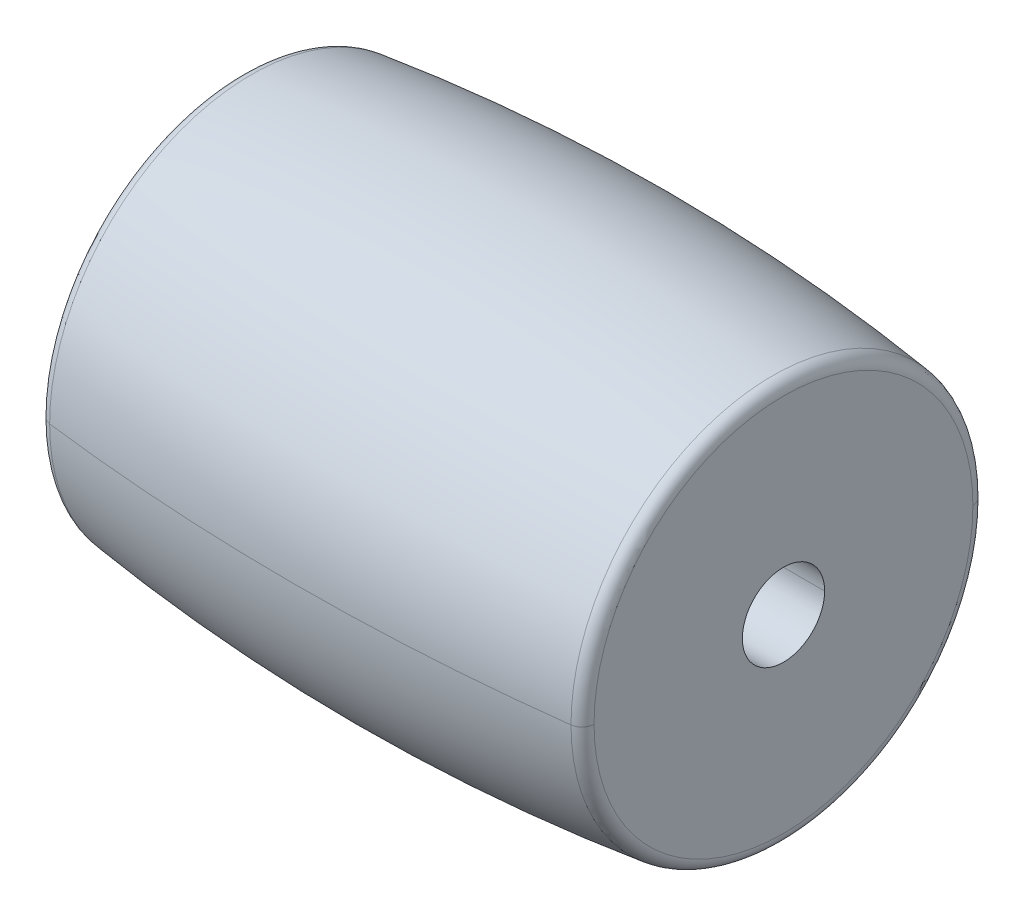
ISO-10303-21;
HEADER;
FILE_DESCRIPTION(('STEP AP214'),'2;1');
FILE_NAME('part.step','',(''),(''),'','','');
FILE_SCHEMA(('AUTOMOTIVE_DESIGN { 1 0 10303 214 1 1 1 1 }'));
ENDSEC;
DATA;
#1=APPLICATION_CONTEXT('core data for automotive mechanical design processes');
#2=APPLICATION_PROTOCOL_DEFINITION('international standard','automotive_design',2000,#1);
#3=PRODUCT_CONTEXT('',#1,'mechanical');
#4=PRODUCT('Part','Part','',(#3));
#5=PRODUCT_RELATED_PRODUCT_CATEGORY('part','',(#4));
#6=PRODUCT_DEFINITION_FORMATION('','',#4);
#7=PRODUCT_DEFINITION_CONTEXT('part definition',#1,'design');
#8=PRODUCT_DEFINITION('design','',#6,#7);
#9=PRODUCT_DEFINITION_SHAPE('','',#8);
#10=(LENGTH_UNIT() NAMED_UNIT(*) SI_UNIT(.MILLI.,.METRE.));
#11=(NAMED_UNIT(*) PLANE_ANGLE_UNIT() SI_UNIT($,.RADIAN.));
#12=(NAMED_UNIT(*) SI_UNIT($,.STERADIAN.) SOLID_ANGLE_UNIT());
#13=UNCERTAINTY_MEASURE_WITH_UNIT(LENGTH_MEASURE(1.E-05),#10,'distance_accuracy_value','');
#14=(GEOMETRIC_REPRESENTATION_CONTEXT(3) GLOBAL_UNCERTAINTY_ASSIGNED_CONTEXT((#13)) GLOBAL_UNIT_ASSIGNED_CONTEXT((#10,
#11,#12)) REPRESENTATION_CONTEXT('',''));
#15=CARTESIAN_POINT('',(0.,0.,0.));
#16=DIRECTION('',(0.,0.,1.));
#17=DIRECTION('',(1.,0.,0.));
#18=AXIS2_PLACEMENT_3D('',#15,#16,#17);
#19=CARTESIAN_POINT('',(15.2549870017234,0.,0.));
#20=DIRECTION('',(-1.,0.,0.));
#21=DIRECTION('',(0.,0.,1.));
#22=AXIS2_PLACEMENT_3D('',#19,#20,#21);
#23=CYLINDRICAL_SURFACE('',#22,1.);
#24=DIRECTION('',(-1.,0.,0.));
#25=VECTOR('',#24,1.);
#26=CARTESIAN_POINT('',(15.2549870017234,0.,-1.));
#27=LINE('',#26,#25);
#28=CARTESIAN_POINT('',(6.6,0.,-1.));
#29=VERTEX_POINT('',#28);
#30=CARTESIAN_POINT('',(-6.6,0.,-1.));
#31=VERTEX_POINT('',#30);
#32=EDGE_CURVE('E132',#29,#31,#27,.T.);
#33=ORIENTED_EDGE('',*,*,#32,.F.);
#34=CARTESIAN_POINT('',(6.6,0.,0.));
#35=DIRECTION('',(1.,0.,0.));
#36=DIRECTION('',(0.,0.,1.));
#37=AXIS2_PLACEMENT_3D('',#34,#35,#36);
#38=CIRCLE('',#37,1.);
#39=CARTESIAN_POINT('',(6.6,0.,1.));
#40=VERTEX_POINT('',#39);
#41=EDGE_CURVE('E11',#29,#40,#38,.T.);
#42=ORIENTED_EDGE('',*,*,#41,.T.);
#43=DIRECTION('',(-1.,0.,0.));
#44=VECTOR('',#43,1.);
#45=CARTESIAN_POINT('',(15.2549870017234,0.,1.));
#46=LINE('',#45,#44);
#47=CARTESIAN_POINT('',(-6.6,0.,1.));
#48=VERTEX_POINT('',#47);
#49=EDGE_CURVE('E117',#40,#48,#46,.T.);
#50=ORIENTED_EDGE('',*,*,#49,.T.);
#51=CARTESIAN_POINT('',(-6.6,0.,0.));
#52=DIRECTION('',(-1.,0.,0.));
#53=DIRECTION('',(0.,0.,1.));
#54=AXIS2_PLACEMENT_3D('',#51,#52,#53);
#55=CIRCLE('',#54,1.);
#56=EDGE_CURVE('E101',#48,#31,#55,.T.);
#57=ORIENTED_EDGE('',*,*,#56,.T.);
#58=EDGE_LOOP('',(#33,#42,#50,#57));
#59=FACE_BOUND('',#58,.T.);
#60=ADVANCED_FACE('F17',(#59),#23,.F.);
#61=CARTESIAN_POINT('',(-6.3,0.,0.));
#62=DIRECTION('',(1.,0.,0.));
#63=DIRECTION('',(0.,0.,-1.));
#64=AXIS2_PLACEMENT_3D('',#61,#62,#63);
#65=TOROIDAL_SURFACE('',#64,4.60548872129678,0.3);
#66=CARTESIAN_POINT('',(-6.3,0.,4.60548872129678));
#67=DIRECTION('',(0.,1.,0.));
#68=DIRECTION('',(0.,0.,1.));
#69=AXIS2_PLACEMENT_3D('',#66,#67,#68);
#70=CIRCLE('',#69,0.3);
#71=CARTESIAN_POINT('',(-6.6,0.,4.60548872129678));
#72=VERTEX_POINT('',#71);
#73=CARTESIAN_POINT('',(-6.33742574257426,0.,4.90314508993815));
#74=VERTEX_POINT('',#73);
#75=EDGE_CURVE('E106',#72,#74,#70,.T.);
#76=ORIENTED_EDGE('',*,*,#75,.F.);
#77=CARTESIAN_POINT('',(-6.6,0.,0.));
#78=DIRECTION('',(-1.,0.,0.));
#79=DIRECTION('',(0.,0.,-1.));
#80=AXIS2_PLACEMENT_3D('',#77,#78,#79);
#81=CIRCLE('',#80,4.60548872129678);
#82=CARTESIAN_POINT('',(-6.6,0.,-4.60548872129678));
#83=VERTEX_POINT('',#82);
#84=EDGE_CURVE('E93',#83,#72,#81,.T.);
#85=ORIENTED_EDGE('',*,*,#84,.F.);
#86=CARTESIAN_POINT('',(-6.3,0.,-4.60548872129678));
#87=DIRECTION('',(0.,-1.,0.));
#88=DIRECTION('',(0.,0.,-1.));
#89=AXIS2_PLACEMENT_3D('',#86,#87,#88);
#90=CIRCLE('',#89,0.3);
#91=CARTESIAN_POINT('',(-6.33742574257426,0.,-4.90314508993815));
#92=VERTEX_POINT('',#91);
#93=EDGE_CURVE('E115',#83,#92,#90,.T.);
#94=ORIENTED_EDGE('',*,*,#93,.T.);
#95=CARTESIAN_POINT('',(-6.33742574257426,0.,0.));
#96=DIRECTION('',(1.,0.,0.));
#97=DIRECTION('',(0.,0.,-1.));
#98=AXIS2_PLACEMENT_3D('',#95,#96,#97);
#99=CIRCLE('',#98,4.90314508993815);
#100=EDGE_CURVE('E102',#74,#92,#99,.T.);
#101=ORIENTED_EDGE('',*,*,#100,.F.);
#102=EDGE_LOOP('',(#76,#85,#94,#101));
#103=FACE_BOUND('',#102,.T.);
#104=ADVANCED_FACE('F107',(#103),#65,.T.);
#105=CARTESIAN_POINT('',(6.3,0.,0.));
#106=DIRECTION('',(-1.,0.,0.));
#107=DIRECTION('',(0.,0.,1.));
#108=AXIS2_PLACEMENT_3D('',#105,#106,#107);
#109=TOROIDAL_SURFACE('',#108,4.60548872129678,0.3);
#110=CARTESIAN_POINT('',(6.3,0.,-4.60548872129678));
#111=DIRECTION('',(0.,1.,0.));
#112=DIRECTION('',(0.,0.,1.));
#113=AXIS2_PLACEMENT_3D('',#110,#111,#112);
#114=CIRCLE('',#113,0.3);
#115=CARTESIAN_POINT('',(6.6,0.,-4.60548872129678));
#116=VERTEX_POINT('',#115);
#117=CARTESIAN_POINT('',(6.33742574257426,0.,-4.90314508993815));
#118=VERTEX_POINT('',#117);
#119=EDGE_CURVE('E149',#116,#118,#114,.T.);
#120=ORIENTED_EDGE('',*,*,#119,.F.);
#121=CARTESIAN_POINT('',(6.6,0.,0.));
#122=DIRECTION('',(1.,0.,0.));
#123=DIRECTION('',(0.,0.,1.));
#124=AXIS2_PLACEMENT_3D('',#121,#122,#123);
#125=CIRCLE('',#124,4.60548872129678);
#126=CARTESIAN_POINT('',(6.6,0.,4.60548872129678));
#127=VERTEX_POINT('',#126);
#128=EDGE_CURVE('E28',#127,#116,#125,.T.);
#129=ORIENTED_EDGE('',*,*,#128,.F.);
#130=CARTESIAN_POINT('',(6.3,0.,4.60548872129678));
#131=DIRECTION('',(0.,-1.,0.));
#132=DIRECTION('',(0.,0.,-1.));
#133=AXIS2_PLACEMENT_3D('',#130,#131,#132);
#134=CIRCLE('',#133,0.3);
#135=CARTESIAN_POINT('',(6.33742574257426,0.,4.90314508993815));
#136=VERTEX_POINT('',#135);
#137=EDGE_CURVE('E142',#127,#136,#134,.T.);
#138=ORIENTED_EDGE('',*,*,#137,.T.);
#139=CARTESIAN_POINT('',(6.33742574257426,0.,0.));
#140=DIRECTION('',(-1.,0.,0.));
#141=DIRECTION('',(0.,0.,1.));
#142=AXIS2_PLACEMENT_3D('',#139,#140,#141);
#143=CIRCLE('',#142,4.90314508993815);
#144=EDGE_CURVE('E43',#118,#136,#143,.T.);
#145=ORIENTED_EDGE('',*,*,#144,.F.);
#146=EDGE_LOOP('',(#120,#129,#138,#145));
#147=FACE_BOUND('',#146,.T.);
#148=ADVANCED_FACE('F256',(#147),#109,.T.);
#149=CARTESIAN_POINT('',(6.6,4.86943517650361,0.));
#150=DIRECTION('',(-1.,0.,0.));
#151=DIRECTION('',(0.,0.,1.));
#152=AXIS2_PLACEMENT_3D('',#149,#150,#151);
#153=PLANE('',#152);
#154=CARTESIAN_POINT('',(6.6,0.,0.));
#155=DIRECTION('',(1.,0.,0.));
#156=DIRECTION('',(0.,0.,1.));
#157=AXIS2_PLACEMENT_3D('',#154,#155,#156);
#158=CIRCLE('',#157,1.);
#159=EDGE_CURVE('E21',#40,#29,#158,.T.);
#160=ORIENTED_EDGE('',*,*,#159,.F.);
#161=ORIENTED_EDGE('',*,*,#41,.F.);
#162=EDGE_LOOP('',(#160,#161));
#163=FACE_BOUND('',#162,.T.);
#164=ORIENTED_EDGE('',*,*,#128,.T.);
#165=CARTESIAN_POINT('',(6.6,0.,0.));
#166=DIRECTION('',(1.,0.,0.));
#167=DIRECTION('',(0.,0.,1.));
#168=AXIS2_PLACEMENT_3D('',#165,#166,#167);
#169=CIRCLE('',#168,4.60548872129678);
#170=EDGE_CURVE('E139',#116,#127,#169,.T.);
#171=ORIENTED_EDGE('',*,*,#170,.T.);
#172=EDGE_LOOP('',(#164,#171));
#173=FACE_BOUND('',#172,.T.);
#174=ADVANCED_FACE('F276',(#163,#173),#153,.F.);
#175=CARTESIAN_POINT('',(-6.6,4.86943517650361,0.));
#176=DIRECTION('',(1.,0.,0.));
#177=DIRECTION('',(0.,1.,0.));
#178=AXIS2_PLACEMENT_3D('',#175,#176,#177);
#179=PLANE('',#178);
#180=ORIENTED_EDGE('',*,*,#56,.F.);
#181=CARTESIAN_POINT('',(-6.6,0.,0.));
#182=DIRECTION('',(-1.,0.,0.));
#183=DIRECTION('',(0.,0.,1.));
#184=AXIS2_PLACEMENT_3D('',#181,#182,#183);
#185=CIRCLE('',#184,1.);
#186=EDGE_CURVE('E124',#31,#48,#185,.T.);
#187=ORIENTED_EDGE('',*,*,#186,.F.);
#188=EDGE_LOOP('',(#180,#187));
#189=FACE_BOUND('',#188,.T.);
#190=ORIENTED_EDGE('',*,*,#84,.T.);
#191=CARTESIAN_POINT('',(-6.6,0.,0.));
#192=DIRECTION('',(-1.,0.,0.));
#193=DIRECTION('',(0.,0.,-1.));
#194=AXIS2_PLACEMENT_3D('',#191,#192,#193);
#195=CIRCLE('',#194,4.60548872129678);
#196=EDGE_CURVE('E96',#72,#83,#195,.T.);
#197=ORIENTED_EDGE('',*,*,#196,.T.);
#198=EDGE_LOOP('',(#190,#197));
#199=FACE_BOUND('',#198,.T.);
#200=ADVANCED_FACE('F19',(#189,#199),#179,.F.);
#201=CARTESIAN_POINT('',(0.,0.,0.));
#202=DIRECTION('',(-1.,0.,0.));
#203=DIRECTION('',(0.,0.,-1.));
#204=AXIS2_PLACEMENT_3D('',#201,#202,#203);
#205=DEGENERATE_TOROIDAL_SURFACE('',#204,45.5,50.8,.F.);
#206=CARTESIAN_POINT('',(0.,0.,45.5));
#207=DIRECTION('',(0.,1.,0.));
#208=DIRECTION('',(0.,0.,1.));
#209=AXIS2_PLACEMENT_3D('',#206,#207,#208);
#210=CIRCLE('',#209,50.8);
#211=EDGE_CURVE('E136',#118,#92,#210,.T.);
#212=ORIENTED_EDGE('',*,*,#211,.F.);
#213=ORIENTED_EDGE('',*,*,#144,.T.);
#214=CARTESIAN_POINT('',(0.,0.,-45.5));
#215=DIRECTION('',(0.,-1.,0.));
#216=DIRECTION('',(0.,0.,-1.));
#217=AXIS2_PLACEMENT_3D('',#214,#215,#216);
#218=CIRCLE('',#217,50.8);
#219=EDGE_CURVE('E133',#136,#74,#218,.T.);
#220=ORIENTED_EDGE('',*,*,#219,.T.);
#221=ORIENTED_EDGE('',*,*,#100,.T.);
#222=EDGE_LOOP('',(#212,#213,#220,#221));
#223=FACE_BOUND('',#222,.T.);
#224=ADVANCED_FACE('F268',(#223),#205,.F.);
#225=CARTESIAN_POINT('',(0.,0.,0.));
#226=DIRECTION('',(-1.,0.,0.));
#227=DIRECTION('',(0.,0.,-1.));
#228=AXIS2_PLACEMENT_3D('',#225,#226,#227);
#229=DEGENERATE_TOROIDAL_SURFACE('',#228,45.5,50.8,.F.);
#230=CARTESIAN_POINT('',(6.33742574257426,0.,0.));
#231=DIRECTION('',(-1.,0.,0.));
#232=DIRECTION('',(0.,0.,1.));
#233=AXIS2_PLACEMENT_3D('',#230,#231,#232);
#234=CIRCLE('',#233,4.90314508993815);
#235=EDGE_CURVE('E146',#136,#118,#234,.T.);
#236=ORIENTED_EDGE('',*,*,#235,.T.);
#237=ORIENTED_EDGE('',*,*,#211,.T.);
#238=CARTESIAN_POINT('',(-6.33742574257426,0.,0.));
#239=DIRECTION('',(1.,0.,0.));
#240=DIRECTION('',(0.,0.,-1.));
#241=AXIS2_PLACEMENT_3D('',#238,#239,#240);
#242=CIRCLE('',#241,4.90314508993815);
#243=EDGE_CURVE('E112',#92,#74,#242,.T.);
#244=ORIENTED_EDGE('',*,*,#243,.T.);
#245=ORIENTED_EDGE('',*,*,#219,.F.);
#246=EDGE_LOOP('',(#236,#237,#244,#245));
#247=FACE_BOUND('',#246,.T.);
#248=ADVANCED_FACE('F170',(#247),#229,.F.);
#249=CARTESIAN_POINT('',(6.3,0.,0.));
#250=DIRECTION('',(-1.,0.,0.));
#251=DIRECTION('',(0.,0.,1.));
#252=AXIS2_PLACEMENT_3D('',#249,#250,#251);
#253=TOROIDAL_SURFACE('',#252,4.60548872129678,0.3);
#254=ORIENTED_EDGE('',*,*,#170,.F.);
#255=ORIENTED_EDGE('',*,*,#119,.T.);
#256=ORIENTED_EDGE('',*,*,#235,.F.);
#257=ORIENTED_EDGE('',*,*,#137,.F.);
#258=EDGE_LOOP('',(#254,#255,#256,#257));
#259=FACE_BOUND('',#258,.T.);
#260=ADVANCED_FACE('F240',(#259),#253,.T.);
#261=CARTESIAN_POINT('',(-6.3,0.,0.));
#262=DIRECTION('',(1.,0.,0.));
#263=DIRECTION('',(0.,0.,-1.));
#264=AXIS2_PLACEMENT_3D('',#261,#262,#263);
#265=TOROIDAL_SURFACE('',#264,4.60548872129678,0.3);
#266=ORIENTED_EDGE('',*,*,#196,.F.);
#267=ORIENTED_EDGE('',*,*,#75,.T.);
#268=ORIENTED_EDGE('',*,*,#243,.F.);
#269=ORIENTED_EDGE('',*,*,#93,.F.);
#270=EDGE_LOOP('',(#266,#267,#268,#269));
#271=FACE_BOUND('',#270,.T.);
#272=ADVANCED_FACE('F114',(#271),#265,.T.);
#273=CARTESIAN_POINT('',(15.2549870017234,0.,0.));
#274=DIRECTION('',(-1.,0.,0.));
#275=DIRECTION('',(0.,0.,1.));
#276=AXIS2_PLACEMENT_3D('',#273,#274,#275);
#277=CYLINDRICAL_SURFACE('',#276,1.);
#278=ORIENTED_EDGE('',*,*,#159,.T.);
#279=ORIENTED_EDGE('',*,*,#32,.T.);
#280=ORIENTED_EDGE('',*,*,#186,.T.);
#281=ORIENTED_EDGE('',*,*,#49,.F.);
#282=EDGE_LOOP('',(#278,#279,#280,#281));
#283=FACE_BOUND('',#282,.T.);
#284=ADVANCED_FACE('F239',(#283),#277,.F.);
#285=CLOSED_SHELL('',(#60,#104,#148,#174,#200,#224,#248,#260,#272,#284));
#286=MANIFOLD_SOLID_BREP('B1',#285);
#287=ADVANCED_BREP_SHAPE_REPRESENTATION('',(#18,#286),#14);
#288=SHAPE_DEFINITION_REPRESENTATION(#9,#287);
ENDSEC;
END-ISO-10303-21;
